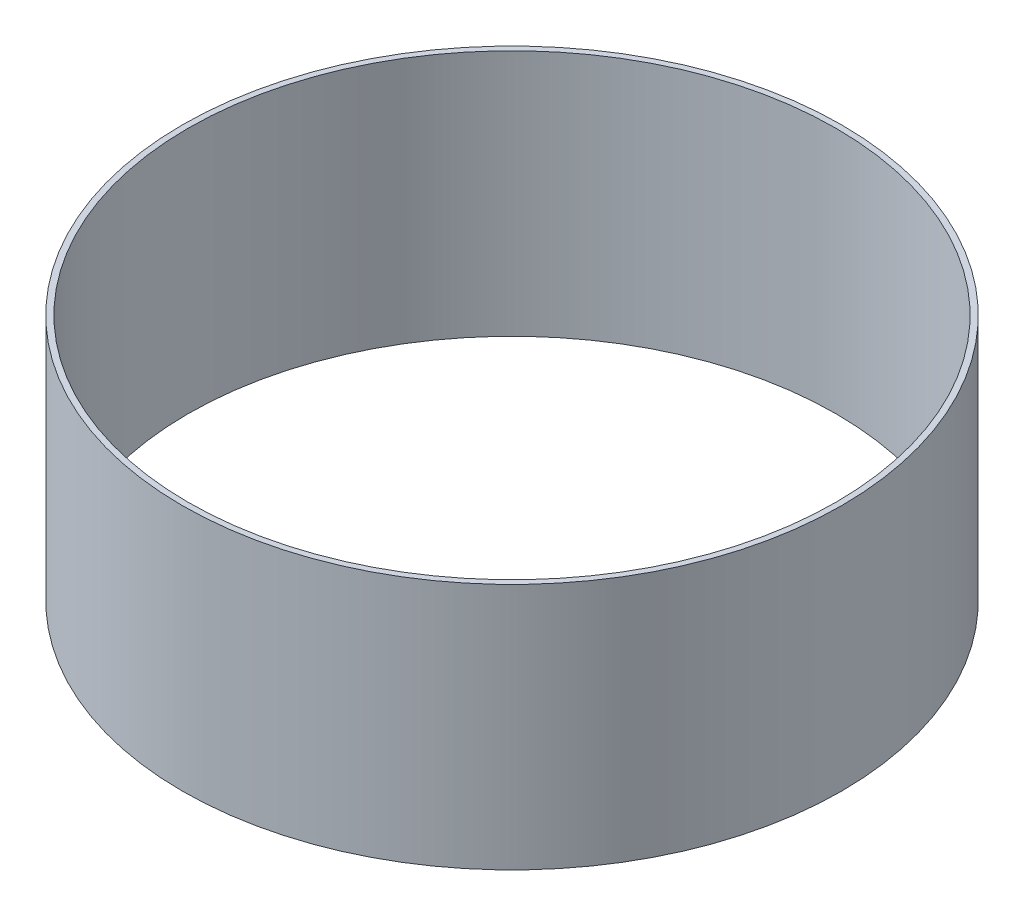
ISO-10303-21;
HEADER;
FILE_DESCRIPTION(('STEP AP214'),'2;1');
FILE_NAME('part.step','',(''),(''),'','','');
FILE_SCHEMA(('AUTOMOTIVE_DESIGN { 1 0 10303 214 1 1 1 1 }'));
ENDSEC;
DATA;
#1=APPLICATION_CONTEXT('core data for automotive mechanical design processes');
#2=APPLICATION_PROTOCOL_DEFINITION('international standard','automotive_design',2000,#1);
#3=PRODUCT_CONTEXT('',#1,'mechanical');
#4=PRODUCT('Part','Part','',(#3));
#5=PRODUCT_RELATED_PRODUCT_CATEGORY('part','',(#4));
#6=PRODUCT_DEFINITION_FORMATION('','',#4);
#7=PRODUCT_DEFINITION_CONTEXT('part definition',#1,'design');
#8=PRODUCT_DEFINITION('design','',#6,#7);
#9=PRODUCT_DEFINITION_SHAPE('','',#8);
#10=(LENGTH_UNIT() NAMED_UNIT(*) SI_UNIT(.MILLI.,.METRE.));
#11=(NAMED_UNIT(*) PLANE_ANGLE_UNIT() SI_UNIT($,.RADIAN.));
#12=(NAMED_UNIT(*) SI_UNIT($,.STERADIAN.) SOLID_ANGLE_UNIT());
#13=UNCERTAINTY_MEASURE_WITH_UNIT(LENGTH_MEASURE(1.E-05),#10,'distance_accuracy_value','');
#14=(GEOMETRIC_REPRESENTATION_CONTEXT(3) GLOBAL_UNCERTAINTY_ASSIGNED_CONTEXT((#13)) GLOBAL_UNIT_ASSIGNED_CONTEXT((#10,
#11,#12)) REPRESENTATION_CONTEXT('',''));
#15=CARTESIAN_POINT('',(0.,0.,0.));
#16=DIRECTION('',(0.,0.,1.));
#17=DIRECTION('',(1.,0.,0.));
#18=AXIS2_PLACEMENT_3D('',#15,#16,#17);
#19=CARTESIAN_POINT('',(0.,150.,0.));
#20=DIRECTION('',(0.,1.,0.));
#21=DIRECTION('',(0.,0.,1.));
#22=AXIS2_PLACEMENT_3D('',#19,#20,#21);
#23=PLANE('',#22);
#24=CARTESIAN_POINT('',(0.,150.,0.));
#25=DIRECTION('',(0.,1.,0.));
#26=DIRECTION('',(0.,0.,1.));
#27=AXIS2_PLACEMENT_3D('',#24,#25,#26);
#28=CIRCLE('',#27,400.);
#29=CARTESIAN_POINT('',(0.,150.,400.));
#30=VERTEX_POINT('',#29);
#31=EDGE_CURVE('E10',#30,#30,#28,.T.);
#32=ORIENTED_EDGE('',*,*,#31,.T.);
#33=EDGE_LOOP('',(#32));
#34=FACE_BOUND('',#33,.T.);
#35=CARTESIAN_POINT('',(0.,150.,0.));
#36=DIRECTION('',(0.,1.,0.));
#37=DIRECTION('',(0.,0.,1.));
#38=AXIS2_PLACEMENT_3D('',#35,#36,#37);
#39=CIRCLE('',#38,393.);
#40=CARTESIAN_POINT('',(0.,150.,393.));
#41=VERTEX_POINT('',#40);
#42=EDGE_CURVE('E42',#41,#41,#39,.T.);
#43=ORIENTED_EDGE('',*,*,#42,.F.);
#44=EDGE_LOOP('',(#43));
#45=FACE_BOUND('',#44,.T.);
#46=ADVANCED_FACE('F31',(#34,#45),#23,.T.);
#47=CARTESIAN_POINT('',(0.,-150.,0.));
#48=DIRECTION('',(0.,1.,0.));
#49=DIRECTION('',(0.,0.,1.));
#50=AXIS2_PLACEMENT_3D('',#47,#48,#49);
#51=PLANE('',#50);
#52=CARTESIAN_POINT('',(0.,-150.,0.));
#53=DIRECTION('',(0.,1.,0.));
#54=DIRECTION('',(0.,0.,1.));
#55=AXIS2_PLACEMENT_3D('',#52,#53,#54);
#56=CIRCLE('',#55,400.);
#57=CARTESIAN_POINT('',(0.,-150.,400.));
#58=VERTEX_POINT('',#57);
#59=EDGE_CURVE('E35',#58,#58,#56,.T.);
#60=ORIENTED_EDGE('',*,*,#59,.F.);
#61=EDGE_LOOP('',(#60));
#62=FACE_BOUND('',#61,.T.);
#63=CARTESIAN_POINT('',(0.,-150.,0.));
#64=DIRECTION('',(0.,1.,0.));
#65=DIRECTION('',(0.,0.,1.));
#66=AXIS2_PLACEMENT_3D('',#63,#64,#65);
#67=CIRCLE('',#66,393.);
#68=CARTESIAN_POINT('',(0.,-150.,393.));
#69=VERTEX_POINT('',#68);
#70=EDGE_CURVE('E44',#69,#69,#67,.T.);
#71=ORIENTED_EDGE('',*,*,#70,.T.);
#72=EDGE_LOOP('',(#71));
#73=FACE_BOUND('',#72,.T.);
#74=ADVANCED_FACE('F54',(#62,#73),#51,.F.);
#75=CARTESIAN_POINT('',(0.,150.,0.));
#76=DIRECTION('',(0.,-1.,0.));
#77=DIRECTION('',(0.,0.,-1.));
#78=AXIS2_PLACEMENT_3D('',#75,#76,#77);
#79=CYLINDRICAL_SURFACE('',#78,400.);
#80=ORIENTED_EDGE('',*,*,#31,.F.);
#81=EDGE_LOOP('',(#80));
#82=FACE_BOUND('',#81,.T.);
#83=ORIENTED_EDGE('',*,*,#59,.T.);
#84=EDGE_LOOP('',(#83));
#85=FACE_BOUND('',#84,.T.);
#86=ADVANCED_FACE('F33',(#82,#85),#79,.T.);
#87=CARTESIAN_POINT('',(0.,150.,0.));
#88=DIRECTION('',(0.,-1.,0.));
#89=DIRECTION('',(0.,0.,-1.));
#90=AXIS2_PLACEMENT_3D('',#87,#88,#89);
#91=CYLINDRICAL_SURFACE('',#90,393.);
#92=ORIENTED_EDGE('',*,*,#42,.T.);
#93=EDGE_LOOP('',(#92));
#94=FACE_BOUND('',#93,.T.);
#95=ORIENTED_EDGE('',*,*,#70,.F.);
#96=EDGE_LOOP('',(#95));
#97=FACE_BOUND('',#96,.T.);
#98=ADVANCED_FACE('F50',(#94,#97),#91,.F.);
#99=CLOSED_SHELL('',(#46,#74,#86,#98));
#100=MANIFOLD_SOLID_BREP('B2',#99);
#101=ADVANCED_BREP_SHAPE_REPRESENTATION('',(#18,#100),#14);
#102=SHAPE_DEFINITION_REPRESENTATION(#9,#101);
ENDSEC;
END-ISO-10303-21;
